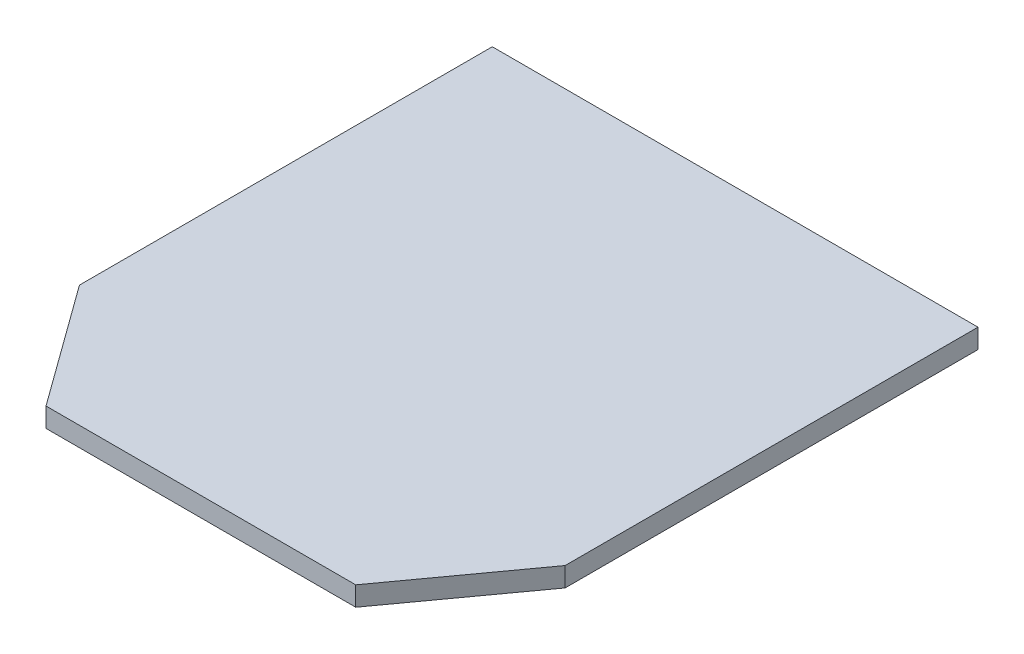
ISO-10303-21;
HEADER;
FILE_DESCRIPTION(('STEP AP214'),'2;1');
FILE_NAME('part.step','',(''),(''),'','','');
FILE_SCHEMA(('AUTOMOTIVE_DESIGN { 1 0 10303 214 1 1 1 1 }'));
ENDSEC;
DATA;
#1=APPLICATION_CONTEXT('core data for automotive mechanical design processes');
#2=APPLICATION_PROTOCOL_DEFINITION('international standard','automotive_design',2000,#1);
#3=PRODUCT_CONTEXT('',#1,'mechanical');
#4=PRODUCT('Part','Part','',(#3));
#5=PRODUCT_RELATED_PRODUCT_CATEGORY('part','',(#4));
#6=PRODUCT_DEFINITION_FORMATION('','',#4);
#7=PRODUCT_DEFINITION_CONTEXT('part definition',#1,'design');
#8=PRODUCT_DEFINITION('design','',#6,#7);
#9=PRODUCT_DEFINITION_SHAPE('','',#8);
#10=(LENGTH_UNIT() NAMED_UNIT(*) SI_UNIT(.MILLI.,.METRE.));
#11=(NAMED_UNIT(*) PLANE_ANGLE_UNIT() SI_UNIT($,.RADIAN.));
#12=(NAMED_UNIT(*) SI_UNIT($,.STERADIAN.) SOLID_ANGLE_UNIT());
#13=UNCERTAINTY_MEASURE_WITH_UNIT(LENGTH_MEASURE(1.E-05),#10,'distance_accuracy_value','');
#14=(GEOMETRIC_REPRESENTATION_CONTEXT(3) GLOBAL_UNCERTAINTY_ASSIGNED_CONTEXT((#13)) GLOBAL_UNIT_ASSIGNED_CONTEXT((#10,
#11,#12)) REPRESENTATION_CONTEXT('',''));
#15=CARTESIAN_POINT('',(0.,0.,0.));
#16=DIRECTION('',(0.,0.,1.));
#17=DIRECTION('',(1.,0.,0.));
#18=AXIS2_PLACEMENT_3D('',#15,#16,#17);
#19=CARTESIAN_POINT('',(76.3565674595154,4.,55.3280175713039));
#20=DIRECTION('',(0.809764094601333,0.,0.586755580369274));
#21=DIRECTION('',(0.586755580369274,0.,-0.809764094601333));
#22=AXIS2_PLACEMENT_3D('',#19,#20,#21);
#23=PLANE('',#22);
#24=DIRECTION('',(-0.586755580369274,0.,0.809764094601333));
#25=VECTOR('',#24,1.);
#26=CARTESIAN_POINT('',(76.3565674595154,0.,55.3280175713039));
#27=LINE('',#26,#25);
#28=CARTESIAN_POINT('',(54.8562300319489,0.,85.));
#29=VERTEX_POINT('',#28);
#30=CARTESIAN_POINT('',(36.741214057508,0.,110.));
#31=VERTEX_POINT('',#30);
#32=EDGE_CURVE('E115',#29,#31,#27,.T.);
#33=ORIENTED_EDGE('',*,*,#32,.F.);
#34=DIRECTION('',(0.,-1.,0.));
#35=VECTOR('',#34,1.);
#36=CARTESIAN_POINT('',(54.8562300319489,4.,85.));
#37=LINE('',#36,#35);
#38=CARTESIAN_POINT('',(54.8562300319489,4.,85.));
#39=VERTEX_POINT('',#38);
#40=EDGE_CURVE('E11',#39,#29,#37,.T.);
#41=ORIENTED_EDGE('',*,*,#40,.F.);
#42=DIRECTION('',(-0.586755580369274,0.,0.809764094601333));
#43=VECTOR('',#42,1.);
#44=CARTESIAN_POINT('',(76.3565674595154,4.,55.3280175713039));
#45=LINE('',#44,#43);
#46=CARTESIAN_POINT('',(36.741214057508,4.,110.));
#47=VERTEX_POINT('',#46);
#48=EDGE_CURVE('E127',#39,#47,#45,.T.);
#49=ORIENTED_EDGE('',*,*,#48,.T.);
#50=DIRECTION('',(0.,-1.,0.));
#51=VECTOR('',#50,1.);
#52=CARTESIAN_POINT('',(36.741214057508,4.,110.));
#53=LINE('',#52,#51);
#54=EDGE_CURVE('E79',#47,#31,#53,.T.);
#55=ORIENTED_EDGE('',*,*,#54,.T.);
#56=EDGE_LOOP('',(#33,#41,#49,#55));
#57=FACE_BOUND('',#56,.T.);
#58=ADVANCED_FACE('F34',(#57),#23,.T.);
#59=CARTESIAN_POINT('',(54.8562300319489,4.,0.));
#60=DIRECTION('',(1.,0.,0.));
#61=DIRECTION('',(0.,0.,-1.));
#62=AXIS2_PLACEMENT_3D('',#59,#60,#61);
#63=PLANE('',#62);
#64=DIRECTION('',(0.,0.,1.));
#65=VECTOR('',#64,1.);
#66=CARTESIAN_POINT('',(54.8562300319489,0.,0.));
#67=LINE('',#66,#65);
#68=CARTESIAN_POINT('',(54.8562300319489,0.,0.));
#69=VERTEX_POINT('',#68);
#70=EDGE_CURVE('E118',#69,#29,#67,.T.);
#71=ORIENTED_EDGE('',*,*,#70,.F.);
#72=DIRECTION('',(0.,-1.,0.));
#73=VECTOR('',#72,1.);
#74=CARTESIAN_POINT('',(54.8562300319489,4.,0.));
#75=LINE('',#74,#73);
#76=CARTESIAN_POINT('',(54.8562300319489,4.,0.));
#77=VERTEX_POINT('',#76);
#78=EDGE_CURVE('E42',#77,#69,#75,.T.);
#79=ORIENTED_EDGE('',*,*,#78,.F.);
#80=DIRECTION('',(0.,0.,1.));
#81=VECTOR('',#80,1.);
#82=CARTESIAN_POINT('',(54.8562300319489,4.,0.));
#83=LINE('',#82,#81);
#84=EDGE_CURVE('E139',#77,#39,#83,.T.);
#85=ORIENTED_EDGE('',*,*,#84,.T.);
#86=ORIENTED_EDGE('',*,*,#40,.T.);
#87=EDGE_LOOP('',(#71,#79,#85,#86));
#88=FACE_BOUND('',#87,.T.);
#89=ADVANCED_FACE('F138',(#88),#63,.T.);
#90=CARTESIAN_POINT('',(0.,4.,0.));
#91=DIRECTION('',(0.,0.,1.));
#92=DIRECTION('',(1.,0.,0.));
#93=AXIS2_PLACEMENT_3D('',#90,#91,#92);
#94=PLANE('',#93);
#95=DIRECTION('',(-1.,0.,0.));
#96=VECTOR('',#95,1.);
#97=CARTESIAN_POINT('',(0.,0.,0.));
#98=LINE('',#97,#96);
#99=CARTESIAN_POINT('',(-45.1437699680511,0.,0.));
#100=VERTEX_POINT('',#99);
#101=EDGE_CURVE('E121',#69,#100,#98,.T.);
#102=ORIENTED_EDGE('',*,*,#101,.T.);
#103=DIRECTION('',(0.,-1.,0.));
#104=VECTOR('',#103,1.);
#105=CARTESIAN_POINT('',(-45.1437699680511,4.,0.));
#106=LINE('',#105,#104);
#107=CARTESIAN_POINT('',(-45.1437699680511,4.,0.));
#108=VERTEX_POINT('',#107);
#109=EDGE_CURVE('E107',#108,#100,#106,.T.);
#110=ORIENTED_EDGE('',*,*,#109,.F.);
#111=DIRECTION('',(-1.,0.,0.));
#112=VECTOR('',#111,1.);
#113=CARTESIAN_POINT('',(0.,4.,0.));
#114=LINE('',#113,#112);
#115=EDGE_CURVE('E98',#77,#108,#114,.T.);
#116=ORIENTED_EDGE('',*,*,#115,.F.);
#117=ORIENTED_EDGE('',*,*,#78,.T.);
#118=EDGE_LOOP('',(#102,#110,#116,#117));
#119=FACE_BOUND('',#118,.T.);
#120=ADVANCED_FACE('F132',(#119),#94,.F.);
#121=CARTESIAN_POINT('',(-45.1437699680511,4.,0.));
#122=DIRECTION('',(1.,0.,0.));
#123=DIRECTION('',(0.,0.,-1.));
#124=AXIS2_PLACEMENT_3D('',#121,#122,#123);
#125=PLANE('',#124);
#126=DIRECTION('',(0.,0.,1.));
#127=VECTOR('',#126,1.);
#128=CARTESIAN_POINT('',(-45.1437699680511,0.,0.));
#129=LINE('',#128,#127);
#130=CARTESIAN_POINT('',(-45.1437699680511,0.,85.));
#131=VERTEX_POINT('',#130);
#132=EDGE_CURVE('E106',#100,#131,#129,.T.);
#133=ORIENTED_EDGE('',*,*,#132,.T.);
#134=DIRECTION('',(0.,-1.,0.));
#135=VECTOR('',#134,1.);
#136=CARTESIAN_POINT('',(-45.1437699680511,4.,85.));
#137=LINE('',#136,#135);
#138=CARTESIAN_POINT('',(-45.1437699680511,4.,85.));
#139=VERTEX_POINT('',#138);
#140=EDGE_CURVE('E103',#139,#131,#137,.T.);
#141=ORIENTED_EDGE('',*,*,#140,.F.);
#142=DIRECTION('',(0.,0.,1.));
#143=VECTOR('',#142,1.);
#144=CARTESIAN_POINT('',(-45.1437699680511,4.,0.));
#145=LINE('',#144,#143);
#146=EDGE_CURVE('E91',#108,#139,#145,.T.);
#147=ORIENTED_EDGE('',*,*,#146,.F.);
#148=ORIENTED_EDGE('',*,*,#109,.T.);
#149=EDGE_LOOP('',(#133,#141,#147,#148));
#150=FACE_BOUND('',#149,.T.);
#151=ADVANCED_FACE('F104',(#150),#125,.F.);
#152=CARTESIAN_POINT('',(-69.9879336503372,4.,50.7133014437587));
#153=DIRECTION('',(0.809764094601333,0.,-0.586755580369273));
#154=DIRECTION('',(-0.586755580369273,0.,-0.809764094601333));
#155=AXIS2_PLACEMENT_3D('',#152,#153,#154);
#156=PLANE('',#155);
#157=DIRECTION('',(0.586755580369273,0.,0.809764094601333));
#158=VECTOR('',#157,1.);
#159=CARTESIAN_POINT('',(-69.9879336503372,0.,50.7133014437587));
#160=LINE('',#159,#158);
#161=CARTESIAN_POINT('',(-27.0287539936102,0.,110.));
#162=VERTEX_POINT('',#161);
#163=EDGE_CURVE('E72',#131,#162,#160,.T.);
#164=ORIENTED_EDGE('',*,*,#163,.T.);
#165=DIRECTION('',(0.,-1.,0.));
#166=VECTOR('',#165,1.);
#167=CARTESIAN_POINT('',(-27.0287539936102,4.,110.));
#168=LINE('',#167,#166);
#169=CARTESIAN_POINT('',(-27.0287539936102,4.,110.));
#170=VERTEX_POINT('',#169);
#171=EDGE_CURVE('E108',#170,#162,#168,.T.);
#172=ORIENTED_EDGE('',*,*,#171,.F.);
#173=DIRECTION('',(0.586755580369273,0.,0.809764094601333));
#174=VECTOR('',#173,1.);
#175=CARTESIAN_POINT('',(-69.9879336503372,4.,50.7133014437587));
#176=LINE('',#175,#174);
#177=EDGE_CURVE('E95',#139,#170,#176,.T.);
#178=ORIENTED_EDGE('',*,*,#177,.F.);
#179=ORIENTED_EDGE('',*,*,#140,.T.);
#180=EDGE_LOOP('',(#164,#172,#178,#179));
#181=FACE_BOUND('',#180,.T.);
#182=ADVANCED_FACE('F110',(#181),#156,.F.);
#183=CARTESIAN_POINT('',(0.,4.,110.));
#184=DIRECTION('',(0.,0.,-1.));
#185=DIRECTION('',(-1.,0.,0.));
#186=AXIS2_PLACEMENT_3D('',#183,#184,#185);
#187=PLANE('',#186);
#188=DIRECTION('',(1.,0.,0.));
#189=VECTOR('',#188,1.);
#190=CARTESIAN_POINT('',(0.,0.,110.));
#191=LINE('',#190,#189);
#192=EDGE_CURVE('E125',#162,#31,#191,.T.);
#193=ORIENTED_EDGE('',*,*,#192,.T.);
#194=ORIENTED_EDGE('',*,*,#54,.F.);
#195=DIRECTION('',(1.,0.,0.));
#196=VECTOR('',#195,1.);
#197=CARTESIAN_POINT('',(0.,4.,110.));
#198=LINE('',#197,#196);
#199=EDGE_CURVE('E50',#170,#47,#198,.T.);
#200=ORIENTED_EDGE('',*,*,#199,.F.);
#201=ORIENTED_EDGE('',*,*,#171,.T.);
#202=EDGE_LOOP('',(#193,#194,#200,#201));
#203=FACE_BOUND('',#202,.T.);
#204=ADVANCED_FACE('F142',(#203),#187,.F.);
#205=CARTESIAN_POINT('',(0.,4.,0.));
#206=DIRECTION('',(0.,1.,0.));
#207=DIRECTION('',(0.,0.,1.));
#208=AXIS2_PLACEMENT_3D('',#205,#206,#207);
#209=PLANE('',#208);
#210=ORIENTED_EDGE('',*,*,#48,.F.);
#211=ORIENTED_EDGE('',*,*,#84,.F.);
#212=ORIENTED_EDGE('',*,*,#115,.T.);
#213=ORIENTED_EDGE('',*,*,#146,.T.);
#214=ORIENTED_EDGE('',*,*,#177,.T.);
#215=ORIENTED_EDGE('',*,*,#199,.T.);
#216=EDGE_LOOP('',(#210,#211,#212,#213,#214,#215));
#217=FACE_BOUND('',#216,.T.);
#218=ADVANCED_FACE('F93',(#217),#209,.T.);
#219=CARTESIAN_POINT('',(0.,0.,0.));
#220=DIRECTION('',(0.,1.,0.));
#221=DIRECTION('',(0.,0.,1.));
#222=AXIS2_PLACEMENT_3D('',#219,#220,#221);
#223=PLANE('',#222);
#224=ORIENTED_EDGE('',*,*,#32,.T.);
#225=ORIENTED_EDGE('',*,*,#192,.F.);
#226=ORIENTED_EDGE('',*,*,#163,.F.);
#227=ORIENTED_EDGE('',*,*,#132,.F.);
#228=ORIENTED_EDGE('',*,*,#101,.F.);
#229=ORIENTED_EDGE('',*,*,#70,.T.);
#230=EDGE_LOOP('',(#224,#225,#226,#227,#228,#229));
#231=FACE_BOUND('',#230,.T.);
#232=ADVANCED_FACE('F137',(#231),#223,.F.);
#233=CLOSED_SHELL('',(#58,#89,#120,#151,#182,#204,#218,#232));
#234=MANIFOLD_SOLID_BREP('B2',#233);
#235=ADVANCED_BREP_SHAPE_REPRESENTATION('',(#18,#234),#14);
#236=SHAPE_DEFINITION_REPRESENTATION(#9,#235);
ENDSEC;
END-ISO-10303-21;
